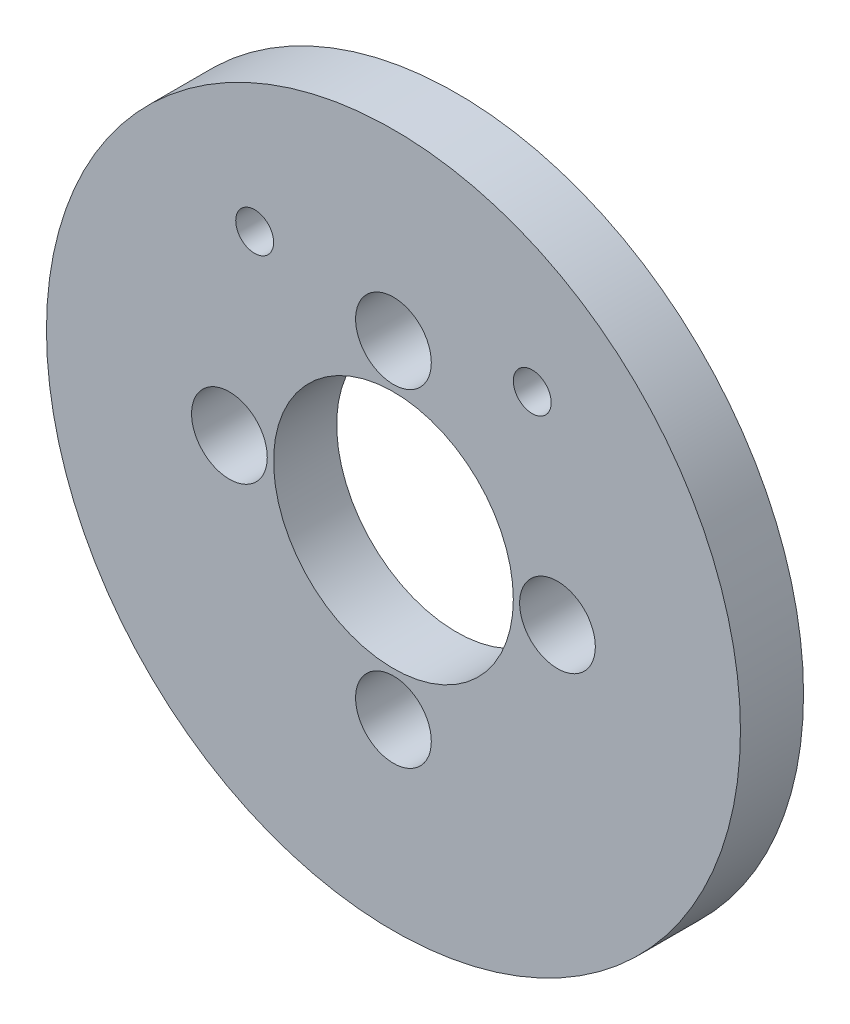
ISO-10303-21;
HEADER;
FILE_DESCRIPTION(('STEP AP214'),'2;1');
FILE_NAME('part.step','',(''),(''),'','','');
FILE_SCHEMA(('AUTOMOTIVE_DESIGN { 1 0 10303 214 1 1 1 1 }'));
ENDSEC;
DATA;
#1=APPLICATION_CONTEXT('core data for automotive mechanical design processes');
#2=APPLICATION_PROTOCOL_DEFINITION('international standard','automotive_design',2000,#1);
#3=PRODUCT_CONTEXT('',#1,'mechanical');
#4=PRODUCT('Part','Part','',(#3));
#5=PRODUCT_RELATED_PRODUCT_CATEGORY('part','',(#4));
#6=PRODUCT_DEFINITION_FORMATION('','',#4);
#7=PRODUCT_DEFINITION_CONTEXT('part definition',#1,'design');
#8=PRODUCT_DEFINITION('design','',#6,#7);
#9=PRODUCT_DEFINITION_SHAPE('','',#8);
#10=(LENGTH_UNIT() NAMED_UNIT(*) SI_UNIT(.MILLI.,.METRE.));
#11=(NAMED_UNIT(*) PLANE_ANGLE_UNIT() SI_UNIT($,.RADIAN.));
#12=(NAMED_UNIT(*) SI_UNIT($,.STERADIAN.) SOLID_ANGLE_UNIT());
#13=UNCERTAINTY_MEASURE_WITH_UNIT(LENGTH_MEASURE(1.E-05),#10,'distance_accuracy_value','');
#14=(GEOMETRIC_REPRESENTATION_CONTEXT(3) GLOBAL_UNCERTAINTY_ASSIGNED_CONTEXT((#13)) GLOBAL_UNIT_ASSIGNED_CONTEXT((#10,
#11,#12)) REPRESENTATION_CONTEXT('',''));
#15=CARTESIAN_POINT('',(0.,0.,0.));
#16=DIRECTION('',(0.,0.,1.));
#17=DIRECTION('',(1.,0.,0.));
#18=AXIS2_PLACEMENT_3D('',#15,#16,#17);
#19=CARTESIAN_POINT('',(0.,0.,5.));
#20=DIRECTION('',(0.,0.,1.));
#21=DIRECTION('',(1.,0.,0.));
#22=AXIS2_PLACEMENT_3D('',#19,#20,#21);
#23=PLANE('',#22);
#24=CARTESIAN_POINT('',(-11.,15.,5.));
#25=DIRECTION('',(0.,0.,1.));
#26=DIRECTION('',(-1.,0.,0.));
#27=AXIS2_PLACEMENT_3D('',#24,#25,#26);
#28=CIRCLE('',#27,1.5);
#29=CARTESIAN_POINT('',(-12.5,15.,5.));
#30=VERTEX_POINT('',#29);
#31=EDGE_CURVE('E79',#30,#30,#28,.T.);
#32=ORIENTED_EDGE('',*,*,#31,.F.);
#33=EDGE_LOOP('',(#32));
#34=FACE_BOUND('',#33,.T.);
#35=CARTESIAN_POINT('',(11.,15.,5.));
#36=DIRECTION('',(0.,0.,1.));
#37=DIRECTION('',(1.,0.,0.));
#38=AXIS2_PLACEMENT_3D('',#35,#36,#37);
#39=CIRCLE('',#38,1.5);
#40=CARTESIAN_POINT('',(12.5,15.,5.));
#41=VERTEX_POINT('',#40);
#42=EDGE_CURVE('E73',#41,#41,#39,.T.);
#43=ORIENTED_EDGE('',*,*,#42,.F.);
#44=EDGE_LOOP('',(#43));
#45=FACE_BOUND('',#44,.T.);
#46=CARTESIAN_POINT('',(2.91433543964104E-13,-12.9999999999999,5.));
#47=DIRECTION('',(0.,0.,1.));
#48=DIRECTION('',(1.,0.,0.));
#49=AXIS2_PLACEMENT_3D('',#46,#47,#48);
#50=CIRCLE('',#49,3.);
#51=CARTESIAN_POINT('',(3.00000000000029,-12.9999999999999,5.));
#52=VERTEX_POINT('',#51);
#53=EDGE_CURVE('E67',#52,#52,#50,.T.);
#54=ORIENTED_EDGE('',*,*,#53,.F.);
#55=EDGE_LOOP('',(#54));
#56=FACE_BOUND('',#55,.T.);
#57=CARTESIAN_POINT('',(13.0000000000002,2.22044604925031E-13,5.));
#58=DIRECTION('',(0.,0.,1.));
#59=DIRECTION('',(1.,0.,0.));
#60=AXIS2_PLACEMENT_3D('',#57,#58,#59);
#61=CIRCLE('',#60,3.);
#62=CARTESIAN_POINT('',(16.0000000000002,2.22044604925031E-13,5.));
#63=VERTEX_POINT('',#62);
#64=EDGE_CURVE('E61',#63,#63,#61,.T.);
#65=ORIENTED_EDGE('',*,*,#64,.F.);
#66=EDGE_LOOP('',(#65));
#67=FACE_BOUND('',#66,.T.);
#68=CARTESIAN_POINT('',(0.,13.0000000000001,5.));
#69=DIRECTION('',(0.,0.,1.));
#70=DIRECTION('',(1.,0.,0.));
#71=AXIS2_PLACEMENT_3D('',#68,#69,#70);
#72=CIRCLE('',#71,3.);
#73=CARTESIAN_POINT('',(2.99999999999997,13.0000000000001,5.));
#74=VERTEX_POINT('',#73);
#75=EDGE_CURVE('E55',#74,#74,#72,.T.);
#76=ORIENTED_EDGE('',*,*,#75,.F.);
#77=EDGE_LOOP('',(#76));
#78=FACE_BOUND('',#77,.T.);
#79=CARTESIAN_POINT('',(-12.9999999999998,0.,5.));
#80=DIRECTION('',(0.,0.,1.));
#81=DIRECTION('',(1.,0.,0.));
#82=AXIS2_PLACEMENT_3D('',#79,#80,#81);
#83=CIRCLE('',#82,3.);
#84=CARTESIAN_POINT('',(-9.99999999999983,0.,5.));
#85=VERTEX_POINT('',#84);
#86=EDGE_CURVE('E49',#85,#85,#83,.T.);
#87=ORIENTED_EDGE('',*,*,#86,.F.);
#88=EDGE_LOOP('',(#87));
#89=FACE_BOUND('',#88,.T.);
#90=CARTESIAN_POINT('',(0.,0.,5.));
#91=DIRECTION('',(0.,0.,1.));
#92=DIRECTION('',(1.,0.,0.));
#93=AXIS2_PLACEMENT_3D('',#90,#91,#92);
#94=CIRCLE('',#93,27.5);
#95=CARTESIAN_POINT('',(27.5,0.,5.));
#96=VERTEX_POINT('',#95);
#97=EDGE_CURVE('E10',#96,#96,#94,.T.);
#98=ORIENTED_EDGE('',*,*,#97,.T.);
#99=EDGE_LOOP('',(#98));
#100=FACE_BOUND('',#99,.T.);
#101=CARTESIAN_POINT('',(0.,0.,5.));
#102=DIRECTION('',(0.,0.,1.));
#103=DIRECTION('',(1.,0.,0.));
#104=AXIS2_PLACEMENT_3D('',#101,#102,#103);
#105=CIRCLE('',#104,9.5);
#106=CARTESIAN_POINT('',(9.5,0.,5.));
#107=VERTEX_POINT('',#106);
#108=EDGE_CURVE('E41',#107,#107,#105,.T.);
#109=ORIENTED_EDGE('',*,*,#108,.F.);
#110=EDGE_LOOP('',(#109));
#111=FACE_BOUND('',#110,.T.);
#112=ADVANCED_FACE('F30',(#34,#45,#56,#67,#78,#89,#100,#111),#23,.T.);
#113=CARTESIAN_POINT('',(0.,0.,0.));
#114=DIRECTION('',(0.,0.,1.));
#115=DIRECTION('',(1.,0.,0.));
#116=AXIS2_PLACEMENT_3D('',#113,#114,#115);
#117=PLANE('',#116);
#118=CARTESIAN_POINT('',(-11.,15.,0.));
#119=DIRECTION('',(0.,0.,1.));
#120=DIRECTION('',(-1.,0.,0.));
#121=AXIS2_PLACEMENT_3D('',#118,#119,#120);
#122=CIRCLE('',#121,1.5);
#123=CARTESIAN_POINT('',(-12.5,15.,0.));
#124=VERTEX_POINT('',#123);
#125=EDGE_CURVE('E76',#124,#124,#122,.T.);
#126=ORIENTED_EDGE('',*,*,#125,.T.);
#127=EDGE_LOOP('',(#126));
#128=FACE_BOUND('',#127,.T.);
#129=CARTESIAN_POINT('',(11.,15.,0.));
#130=DIRECTION('',(0.,0.,1.));
#131=DIRECTION('',(1.,0.,0.));
#132=AXIS2_PLACEMENT_3D('',#129,#130,#131);
#133=CIRCLE('',#132,1.5);
#134=CARTESIAN_POINT('',(12.5,15.,0.));
#135=VERTEX_POINT('',#134);
#136=EDGE_CURVE('E70',#135,#135,#133,.T.);
#137=ORIENTED_EDGE('',*,*,#136,.T.);
#138=EDGE_LOOP('',(#137));
#139=FACE_BOUND('',#138,.T.);
#140=CARTESIAN_POINT('',(2.91433543964104E-13,-12.9999999999999,0.));
#141=DIRECTION('',(0.,0.,1.));
#142=DIRECTION('',(1.,0.,0.));
#143=AXIS2_PLACEMENT_3D('',#140,#141,#142);
#144=CIRCLE('',#143,3.);
#145=CARTESIAN_POINT('',(3.00000000000029,-12.9999999999999,0.));
#146=VERTEX_POINT('',#145);
#147=EDGE_CURVE('E64',#146,#146,#144,.T.);
#148=ORIENTED_EDGE('',*,*,#147,.T.);
#149=EDGE_LOOP('',(#148));
#150=FACE_BOUND('',#149,.T.);
#151=CARTESIAN_POINT('',(13.0000000000002,2.22044604925031E-13,0.));
#152=DIRECTION('',(0.,0.,1.));
#153=DIRECTION('',(1.,0.,0.));
#154=AXIS2_PLACEMENT_3D('',#151,#152,#153);
#155=CIRCLE('',#154,3.);
#156=CARTESIAN_POINT('',(16.0000000000002,2.22044604925031E-13,0.));
#157=VERTEX_POINT('',#156);
#158=EDGE_CURVE('E58',#157,#157,#155,.T.);
#159=ORIENTED_EDGE('',*,*,#158,.T.);
#160=EDGE_LOOP('',(#159));
#161=FACE_BOUND('',#160,.T.);
#162=CARTESIAN_POINT('',(0.,13.0000000000001,0.));
#163=DIRECTION('',(0.,0.,1.));
#164=DIRECTION('',(1.,0.,0.));
#165=AXIS2_PLACEMENT_3D('',#162,#163,#164);
#166=CIRCLE('',#165,3.);
#167=CARTESIAN_POINT('',(2.99999999999997,13.0000000000001,0.));
#168=VERTEX_POINT('',#167);
#169=EDGE_CURVE('E52',#168,#168,#166,.T.);
#170=ORIENTED_EDGE('',*,*,#169,.T.);
#171=EDGE_LOOP('',(#170));
#172=FACE_BOUND('',#171,.T.);
#173=CARTESIAN_POINT('',(-12.9999999999998,0.,0.));
#174=DIRECTION('',(0.,0.,1.));
#175=DIRECTION('',(1.,0.,0.));
#176=AXIS2_PLACEMENT_3D('',#173,#174,#175);
#177=CIRCLE('',#176,3.);
#178=CARTESIAN_POINT('',(-9.99999999999983,0.,0.));
#179=VERTEX_POINT('',#178);
#180=EDGE_CURVE('E46',#179,#179,#177,.T.);
#181=ORIENTED_EDGE('',*,*,#180,.T.);
#182=EDGE_LOOP('',(#181));
#183=FACE_BOUND('',#182,.T.);
#184=CARTESIAN_POINT('',(0.,0.,0.));
#185=DIRECTION('',(0.,0.,1.));
#186=DIRECTION('',(1.,0.,0.));
#187=AXIS2_PLACEMENT_3D('',#184,#185,#186);
#188=CIRCLE('',#187,27.5);
#189=CARTESIAN_POINT('',(27.5,0.,0.));
#190=VERTEX_POINT('',#189);
#191=EDGE_CURVE('E34',#190,#190,#188,.T.);
#192=ORIENTED_EDGE('',*,*,#191,.F.);
#193=EDGE_LOOP('',(#192));
#194=FACE_BOUND('',#193,.T.);
#195=CARTESIAN_POINT('',(0.,0.,0.));
#196=DIRECTION('',(0.,0.,1.));
#197=DIRECTION('',(1.,0.,0.));
#198=AXIS2_PLACEMENT_3D('',#195,#196,#197);
#199=CIRCLE('',#198,9.5);
#200=CARTESIAN_POINT('',(9.5,0.,0.));
#201=VERTEX_POINT('',#200);
#202=EDGE_CURVE('E43',#201,#201,#199,.T.);
#203=ORIENTED_EDGE('',*,*,#202,.T.);
#204=EDGE_LOOP('',(#203));
#205=FACE_BOUND('',#204,.T.);
#206=ADVANCED_FACE('F85',(#128,#139,#150,#161,#172,#183,#194,#205),#117,.F.);
#207=CARTESIAN_POINT('',(0.,0.,5.));
#208=DIRECTION('',(0.,0.,-1.));
#209=DIRECTION('',(-1.,0.,0.));
#210=AXIS2_PLACEMENT_3D('',#207,#208,#209);
#211=CYLINDRICAL_SURFACE('',#210,27.5);
#212=ORIENTED_EDGE('',*,*,#97,.F.);
#213=EDGE_LOOP('',(#212));
#214=FACE_BOUND('',#213,.T.);
#215=ORIENTED_EDGE('',*,*,#191,.T.);
#216=EDGE_LOOP('',(#215));
#217=FACE_BOUND('',#216,.T.);
#218=ADVANCED_FACE('F32',(#214,#217),#211,.T.);
#219=CARTESIAN_POINT('',(0.,0.,5.));
#220=DIRECTION('',(0.,0.,-1.));
#221=DIRECTION('',(-1.,0.,0.));
#222=AXIS2_PLACEMENT_3D('',#219,#220,#221);
#223=CYLINDRICAL_SURFACE('',#222,9.5);
#224=ORIENTED_EDGE('',*,*,#108,.T.);
#225=EDGE_LOOP('',(#224));
#226=FACE_BOUND('',#225,.T.);
#227=ORIENTED_EDGE('',*,*,#202,.F.);
#228=EDGE_LOOP('',(#227));
#229=FACE_BOUND('',#228,.T.);
#230=ADVANCED_FACE('F110',(#226,#229),#223,.F.);
#231=CARTESIAN_POINT('',(-12.9999999999998,0.,0.));
#232=DIRECTION('',(0.,0.,1.));
#233=DIRECTION('',(1.,0.,0.));
#234=AXIS2_PLACEMENT_3D('',#231,#232,#233);
#235=CYLINDRICAL_SURFACE('',#234,3.);
#236=ORIENTED_EDGE('',*,*,#180,.F.);
#237=EDGE_LOOP('',(#236));
#238=FACE_BOUND('',#237,.T.);
#239=ORIENTED_EDGE('',*,*,#86,.T.);
#240=EDGE_LOOP('',(#239));
#241=FACE_BOUND('',#240,.T.);
#242=ADVANCED_FACE('F113',(#238,#241),#235,.F.);
#243=CARTESIAN_POINT('',(0.,13.0000000000001,0.));
#244=DIRECTION('',(0.,0.,1.));
#245=DIRECTION('',(1.,0.,0.));
#246=AXIS2_PLACEMENT_3D('',#243,#244,#245);
#247=CYLINDRICAL_SURFACE('',#246,3.);
#248=ORIENTED_EDGE('',*,*,#169,.F.);
#249=EDGE_LOOP('',(#248));
#250=FACE_BOUND('',#249,.T.);
#251=ORIENTED_EDGE('',*,*,#75,.T.);
#252=EDGE_LOOP('',(#251));
#253=FACE_BOUND('',#252,.T.);
#254=ADVANCED_FACE('F125',(#250,#253),#247,.F.);
#255=CARTESIAN_POINT('',(13.0000000000002,2.22044604925031E-13,0.));
#256=DIRECTION('',(0.,0.,1.));
#257=DIRECTION('',(1.,0.,0.));
#258=AXIS2_PLACEMENT_3D('',#255,#256,#257);
#259=CYLINDRICAL_SURFACE('',#258,3.);
#260=ORIENTED_EDGE('',*,*,#158,.F.);
#261=EDGE_LOOP('',(#260));
#262=FACE_BOUND('',#261,.T.);
#263=ORIENTED_EDGE('',*,*,#64,.T.);
#264=EDGE_LOOP('',(#263));
#265=FACE_BOUND('',#264,.T.);
#266=ADVANCED_FACE('F129',(#262,#265),#259,.F.);
#267=CARTESIAN_POINT('',(2.91433543964104E-13,-12.9999999999999,0.));
#268=DIRECTION('',(0.,0.,1.));
#269=DIRECTION('',(1.,0.,0.));
#270=AXIS2_PLACEMENT_3D('',#267,#268,#269);
#271=CYLINDRICAL_SURFACE('',#270,3.);
#272=ORIENTED_EDGE('',*,*,#147,.F.);
#273=EDGE_LOOP('',(#272));
#274=FACE_BOUND('',#273,.T.);
#275=ORIENTED_EDGE('',*,*,#53,.T.);
#276=EDGE_LOOP('',(#275));
#277=FACE_BOUND('',#276,.T.);
#278=ADVANCED_FACE('F133',(#274,#277),#271,.F.);
#279=CARTESIAN_POINT('',(11.,15.,0.));
#280=DIRECTION('',(0.,0.,1.));
#281=DIRECTION('',(1.,0.,0.));
#282=AXIS2_PLACEMENT_3D('',#279,#280,#281);
#283=CYLINDRICAL_SURFACE('',#282,1.5);
#284=ORIENTED_EDGE('',*,*,#136,.F.);
#285=EDGE_LOOP('',(#284));
#286=FACE_BOUND('',#285,.T.);
#287=ORIENTED_EDGE('',*,*,#42,.T.);
#288=EDGE_LOOP('',(#287));
#289=FACE_BOUND('',#288,.T.);
#290=ADVANCED_FACE('F91',(#286,#289),#283,.F.);
#291=CARTESIAN_POINT('',(-11.,15.,0.));
#292=DIRECTION('',(0.,0.,1.));
#293=DIRECTION('',(1.,0.,0.));
#294=AXIS2_PLACEMENT_3D('',#291,#292,#293);
#295=CYLINDRICAL_SURFACE('',#294,1.5);
#296=ORIENTED_EDGE('',*,*,#125,.F.);
#297=EDGE_LOOP('',(#296));
#298=FACE_BOUND('',#297,.T.);
#299=ORIENTED_EDGE('',*,*,#31,.T.);
#300=EDGE_LOOP('',(#299));
#301=FACE_BOUND('',#300,.T.);
#302=ADVANCED_FACE('F88',(#298,#301),#295,.F.);
#303=CLOSED_SHELL('',(#112,#206,#218,#230,#242,#254,#266,#278,#290,#302));
#304=MANIFOLD_SOLID_BREP('B2',#303);
#305=ADVANCED_BREP_SHAPE_REPRESENTATION('',(#18,#304),#14);
#306=SHAPE_DEFINITION_REPRESENTATION(#9,#305);
ENDSEC;
END-ISO-10303-21;
